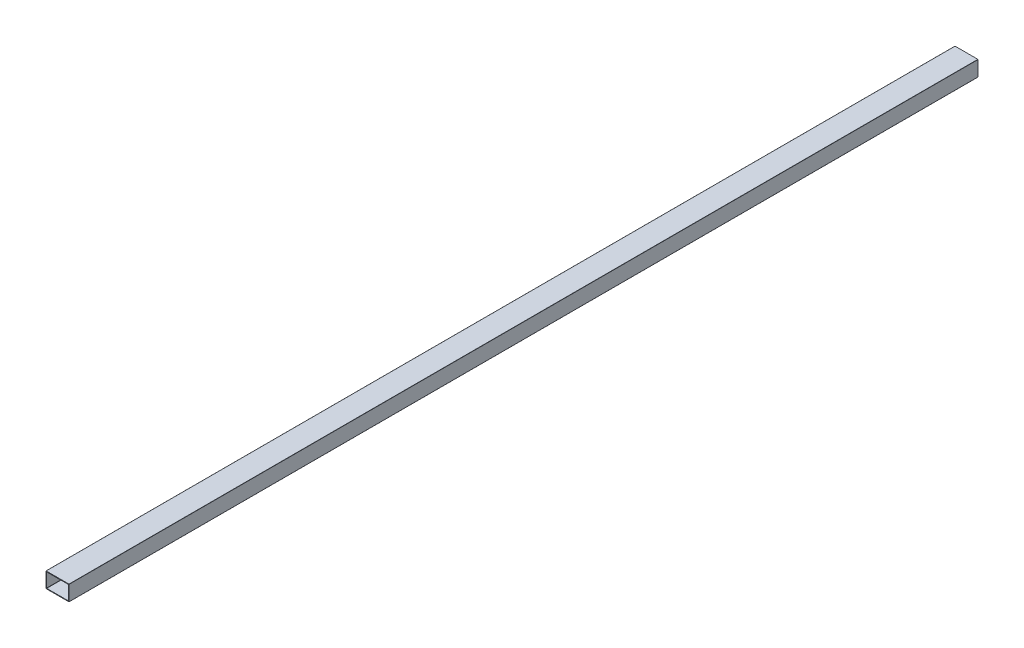
ISO-10303-21;
HEADER;
FILE_DESCRIPTION(('STEP AP214'),'2;1');
FILE_NAME('part.step','',(''),(''),'','','');
FILE_SCHEMA(('AUTOMOTIVE_DESIGN { 1 0 10303 214 1 1 1 1 }'));
ENDSEC;
DATA;
#1=APPLICATION_CONTEXT('core data for automotive mechanical design processes');
#2=APPLICATION_PROTOCOL_DEFINITION('international standard','automotive_design',2000,#1);
#3=PRODUCT_CONTEXT('',#1,'mechanical');
#4=PRODUCT('Part','Part','',(#3));
#5=PRODUCT_RELATED_PRODUCT_CATEGORY('part','',(#4));
#6=PRODUCT_DEFINITION_FORMATION('','',#4);
#7=PRODUCT_DEFINITION_CONTEXT('part definition',#1,'design');
#8=PRODUCT_DEFINITION('design','',#6,#7);
#9=PRODUCT_DEFINITION_SHAPE('','',#8);
#10=(LENGTH_UNIT() NAMED_UNIT(*) SI_UNIT(.MILLI.,.METRE.));
#11=(NAMED_UNIT(*) PLANE_ANGLE_UNIT() SI_UNIT($,.RADIAN.));
#12=(NAMED_UNIT(*) SI_UNIT($,.STERADIAN.) SOLID_ANGLE_UNIT());
#13=UNCERTAINTY_MEASURE_WITH_UNIT(LENGTH_MEASURE(1.E-05),#10,'distance_accuracy_value','');
#14=(GEOMETRIC_REPRESENTATION_CONTEXT(3) GLOBAL_UNCERTAINTY_ASSIGNED_CONTEXT((#13)) GLOBAL_UNIT_ASSIGNED_CONTEXT((#10,
#11,#12)) REPRESENTATION_CONTEXT('',''));
#15=CARTESIAN_POINT('',(0.,0.,0.));
#16=DIRECTION('',(0.,0.,1.));
#17=DIRECTION('',(1.,0.,0.));
#18=AXIS2_PLACEMENT_3D('',#15,#16,#17);
#19=CARTESIAN_POINT('',(76.2,-50.8,-6000.));
#20=DIRECTION('',(1.,0.,0.));
#21=DIRECTION('',(0.,0.,-1.));
#22=AXIS2_PLACEMENT_3D('',#19,#20,#21);
#23=PLANE('',#22);
#24=DIRECTION('',(0.,1.,0.));
#25=VECTOR('',#24,1.);
#26=CARTESIAN_POINT('',(76.2,-50.8,0.));
#27=LINE('',#26,#25);
#28=CARTESIAN_POINT('',(76.2,-49.8,0.));
#29=VERTEX_POINT('',#28);
#30=CARTESIAN_POINT('',(76.2,49.8,0.));
#31=VERTEX_POINT('',#30);
#32=EDGE_CURVE('E197',#29,#31,#27,.T.);
#33=ORIENTED_EDGE('',*,*,#32,.F.);
#34=DIRECTION('',(0.,0.,1.));
#35=VECTOR('',#34,1.);
#36=CARTESIAN_POINT('',(76.2,-49.8,-6000.));
#37=LINE('',#36,#35);
#38=CARTESIAN_POINT('',(76.2,-49.8,-6000.));
#39=VERTEX_POINT('',#38);
#40=EDGE_CURVE('E158',#29,#39,#37,.F.);
#41=ORIENTED_EDGE('',*,*,#40,.T.);
#42=DIRECTION('',(0.,1.,0.));
#43=VECTOR('',#42,1.);
#44=CARTESIAN_POINT('',(76.2,-50.8,-6000.));
#45=LINE('',#44,#43);
#46=CARTESIAN_POINT('',(76.2,49.8,-6000.));
#47=VERTEX_POINT('',#46);
#48=EDGE_CURVE('E185',#39,#47,#45,.T.);
#49=ORIENTED_EDGE('',*,*,#48,.T.);
#50=DIRECTION('',(0.,0.,1.));
#51=VECTOR('',#50,1.);
#52=CARTESIAN_POINT('',(76.2,49.8,-6000.));
#53=LINE('',#52,#51);
#54=EDGE_CURVE('E251',#47,#31,#53,.T.);
#55=ORIENTED_EDGE('',*,*,#54,.T.);
#56=EDGE_LOOP('',(#33,#41,#49,#55));
#57=FACE_BOUND('',#56,.T.);
#58=ADVANCED_FACE('F33',(#57),#23,.T.);
#59=CARTESIAN_POINT('',(-76.2,-50.8,-6000.));
#60=DIRECTION('',(0.,-1.,0.));
#61=DIRECTION('',(0.,0.,-1.));
#62=AXIS2_PLACEMENT_3D('',#59,#60,#61);
#63=PLANE('',#62);
#64=DIRECTION('',(1.,0.,0.));
#65=VECTOR('',#64,1.);
#66=CARTESIAN_POINT('',(-76.2,-50.8,0.));
#67=LINE('',#66,#65);
#68=CARTESIAN_POINT('',(-75.2,-50.8,0.));
#69=VERTEX_POINT('',#68);
#70=CARTESIAN_POINT('',(75.2,-50.8,0.));
#71=VERTEX_POINT('',#70);
#72=EDGE_CURVE('E189',#69,#71,#67,.T.);
#73=ORIENTED_EDGE('',*,*,#72,.F.);
#74=DIRECTION('',(0.,0.,1.));
#75=VECTOR('',#74,1.);
#76=CARTESIAN_POINT('',(-75.2,-50.8,-6000.));
#77=LINE('',#76,#75);
#78=CARTESIAN_POINT('',(-75.2,-50.8,-6000.));
#79=VERTEX_POINT('',#78);
#80=EDGE_CURVE('E238',#69,#79,#77,.F.);
#81=ORIENTED_EDGE('',*,*,#80,.T.);
#82=DIRECTION('',(1.,0.,0.));
#83=VECTOR('',#82,1.);
#84=CARTESIAN_POINT('',(-76.2,-50.8,-6000.));
#85=LINE('',#84,#83);
#86=CARTESIAN_POINT('',(75.2,-50.8,-6000.));
#87=VERTEX_POINT('',#86);
#88=EDGE_CURVE('E194',#79,#87,#85,.T.);
#89=ORIENTED_EDGE('',*,*,#88,.T.);
#90=DIRECTION('',(0.,0.,1.));
#91=VECTOR('',#90,1.);
#92=CARTESIAN_POINT('',(75.2,-50.8,-6000.));
#93=LINE('',#92,#91);
#94=EDGE_CURVE('E235',#87,#71,#93,.T.);
#95=ORIENTED_EDGE('',*,*,#94,.T.);
#96=EDGE_LOOP('',(#73,#81,#89,#95));
#97=FACE_BOUND('',#96,.T.);
#98=ADVANCED_FACE('F305',(#97),#63,.T.);
#99=CARTESIAN_POINT('',(-76.2,-50.8,-6000.));
#100=DIRECTION('',(-1.,0.,0.));
#101=DIRECTION('',(0.,0.,1.));
#102=AXIS2_PLACEMENT_3D('',#99,#100,#101);
#103=PLANE('',#102);
#104=DIRECTION('',(0.,-1.,0.));
#105=VECTOR('',#104,1.);
#106=CARTESIAN_POINT('',(-76.2,-50.8,-6000.));
#107=LINE('',#106,#105);
#108=CARTESIAN_POINT('',(-76.2,49.8,-6000.));
#109=VERTEX_POINT('',#108);
#110=CARTESIAN_POINT('',(-76.2,-49.8,-6000.));
#111=VERTEX_POINT('',#110);
#112=EDGE_CURVE('E191',#109,#111,#107,.T.);
#113=ORIENTED_EDGE('',*,*,#112,.T.);
#114=DIRECTION('',(0.,0.,1.));
#115=VECTOR('',#114,1.);
#116=CARTESIAN_POINT('',(-76.2,-49.8,-6000.));
#117=LINE('',#116,#115);
#118=CARTESIAN_POINT('',(-76.2,-49.8,0.));
#119=VERTEX_POINT('',#118);
#120=EDGE_CURVE('E224',#111,#119,#117,.T.);
#121=ORIENTED_EDGE('',*,*,#120,.T.);
#122=DIRECTION('',(0.,-1.,0.));
#123=VECTOR('',#122,1.);
#124=CARTESIAN_POINT('',(-76.2,-50.8,0.));
#125=LINE('',#124,#123);
#126=CARTESIAN_POINT('',(-76.2,49.8,0.));
#127=VERTEX_POINT('',#126);
#128=EDGE_CURVE('E203',#127,#119,#125,.T.);
#129=ORIENTED_EDGE('',*,*,#128,.F.);
#130=DIRECTION('',(0.,0.,1.));
#131=VECTOR('',#130,1.);
#132=CARTESIAN_POINT('',(-76.2,49.8,-6000.));
#133=LINE('',#132,#131);
#134=EDGE_CURVE('E222',#127,#109,#133,.F.);
#135=ORIENTED_EDGE('',*,*,#134,.T.);
#136=EDGE_LOOP('',(#113,#121,#129,#135));
#137=FACE_BOUND('',#136,.T.);
#138=ADVANCED_FACE('F311',(#137),#103,.T.);
#139=CARTESIAN_POINT('',(-76.2,50.8,-6000.));
#140=DIRECTION('',(0.,1.,0.));
#141=DIRECTION('',(0.,0.,1.));
#142=AXIS2_PLACEMENT_3D('',#139,#140,#141);
#143=PLANE('',#142);
#144=DIRECTION('',(-1.,0.,0.));
#145=VECTOR('',#144,1.);
#146=CARTESIAN_POINT('',(-76.2,50.8,-6000.));
#147=LINE('',#146,#145);
#148=CARTESIAN_POINT('',(75.2,50.8,-6000.));
#149=VERTEX_POINT('',#148);
#150=CARTESIAN_POINT('',(-75.2,50.8,-6000.));
#151=VERTEX_POINT('',#150);
#152=EDGE_CURVE('E188',#149,#151,#147,.T.);
#153=ORIENTED_EDGE('',*,*,#152,.T.);
#154=DIRECTION('',(0.,0.,1.));
#155=VECTOR('',#154,1.);
#156=CARTESIAN_POINT('',(-75.2,50.8,-6000.));
#157=LINE('',#156,#155);
#158=CARTESIAN_POINT('',(-75.2,50.8,0.));
#159=VERTEX_POINT('',#158);
#160=EDGE_CURVE('E248',#151,#159,#157,.T.);
#161=ORIENTED_EDGE('',*,*,#160,.T.);
#162=DIRECTION('',(-1.,0.,0.));
#163=VECTOR('',#162,1.);
#164=CARTESIAN_POINT('',(-76.2,50.8,0.));
#165=LINE('',#164,#163);
#166=CARTESIAN_POINT('',(75.2,50.8,0.));
#167=VERTEX_POINT('',#166);
#168=EDGE_CURVE('E200',#167,#159,#165,.T.);
#169=ORIENTED_EDGE('',*,*,#168,.F.);
#170=DIRECTION('',(0.,0.,1.));
#171=VECTOR('',#170,1.);
#172=CARTESIAN_POINT('',(75.2,50.8,-6000.));
#173=LINE('',#172,#171);
#174=EDGE_CURVE('E55',#167,#149,#173,.F.);
#175=ORIENTED_EDGE('',*,*,#174,.T.);
#176=EDGE_LOOP('',(#153,#161,#169,#175));
#177=FACE_BOUND('',#176,.T.);
#178=ADVANCED_FACE('F316',(#177),#143,.T.);
#179=CARTESIAN_POINT('',(0.,0.,-6000.));
#180=DIRECTION('',(0.,0.,-1.));
#181=DIRECTION('',(-1.,0.,0.));
#182=AXIS2_PLACEMENT_3D('',#179,#180,#181);
#183=PLANE('',#182);
#184=DIRECTION('',(0.,-1.,0.));
#185=VECTOR('',#184,1.);
#186=CARTESIAN_POINT('',(-72.4,-47.,-6000.));
#187=LINE('',#186,#185);
#188=CARTESIAN_POINT('',(-72.4,46.,-6000.));
#189=VERTEX_POINT('',#188);
#190=CARTESIAN_POINT('',(-72.4,-46.,-6000.));
#191=VERTEX_POINT('',#190);
#192=EDGE_CURVE('E167',#189,#191,#187,.T.);
#193=ORIENTED_EDGE('',*,*,#192,.T.);
#194=CARTESIAN_POINT('',(-71.4,-46.,-6000.));
#195=DIRECTION('',(0.,0.,-1.));
#196=DIRECTION('',(-1.,0.,0.));
#197=AXIS2_PLACEMENT_3D('',#194,#195,#196);
#198=CIRCLE('',#197,1.);
#199=CARTESIAN_POINT('',(-71.4,-47.,-6000.));
#200=VERTEX_POINT('',#199);
#201=EDGE_CURVE('E11',#191,#200,#198,.F.);
#202=ORIENTED_EDGE('',*,*,#201,.T.);
#203=DIRECTION('',(1.,0.,0.));
#204=VECTOR('',#203,1.);
#205=CARTESIAN_POINT('',(-72.4,-47.,-6000.));
#206=LINE('',#205,#204);
#207=CARTESIAN_POINT('',(71.4,-47.,-6000.));
#208=VERTEX_POINT('',#207);
#209=EDGE_CURVE('E175',#200,#208,#206,.T.);
#210=ORIENTED_EDGE('',*,*,#209,.T.);
#211=CARTESIAN_POINT('',(71.4,-46.,-6000.));
#212=DIRECTION('',(0.,0.,-1.));
#213=DIRECTION('',(-1.,0.,0.));
#214=AXIS2_PLACEMENT_3D('',#211,#212,#213);
#215=CIRCLE('',#214,1.);
#216=CARTESIAN_POINT('',(72.4,-46.,-6000.));
#217=VERTEX_POINT('',#216);
#218=EDGE_CURVE('E262',#208,#217,#215,.F.);
#219=ORIENTED_EDGE('',*,*,#218,.T.);
#220=DIRECTION('',(0.,1.,0.));
#221=VECTOR('',#220,1.);
#222=CARTESIAN_POINT('',(72.4,-47.,-6000.));
#223=LINE('',#222,#221);
#224=CARTESIAN_POINT('',(72.4,46.,-6000.));
#225=VERTEX_POINT('',#224);
#226=EDGE_CURVE('E179',#217,#225,#223,.T.);
#227=ORIENTED_EDGE('',*,*,#226,.T.);
#228=CARTESIAN_POINT('',(71.4,46.,-6000.));
#229=DIRECTION('',(0.,0.,-1.));
#230=DIRECTION('',(-1.,0.,0.));
#231=AXIS2_PLACEMENT_3D('',#228,#229,#230);
#232=CIRCLE('',#231,1.);
#233=CARTESIAN_POINT('',(71.4,47.,-6000.));
#234=VERTEX_POINT('',#233);
#235=EDGE_CURVE('E258',#225,#234,#232,.F.);
#236=ORIENTED_EDGE('',*,*,#235,.T.);
#237=DIRECTION('',(-1.,0.,0.));
#238=VECTOR('',#237,1.);
#239=CARTESIAN_POINT('',(-72.4,47.,-6000.));
#240=LINE('',#239,#238);
#241=CARTESIAN_POINT('',(-71.4,47.,-6000.));
#242=VERTEX_POINT('',#241);
#243=EDGE_CURVE('E277',#234,#242,#240,.T.);
#244=ORIENTED_EDGE('',*,*,#243,.T.);
#245=CARTESIAN_POINT('',(-71.4,46.,-6000.));
#246=DIRECTION('',(0.,0.,-1.));
#247=DIRECTION('',(-1.,0.,0.));
#248=AXIS2_PLACEMENT_3D('',#245,#246,#247);
#249=CIRCLE('',#248,1.);
#250=EDGE_CURVE('E157',#242,#189,#249,.F.);
#251=ORIENTED_EDGE('',*,*,#250,.T.);
#252=EDGE_LOOP('',(#193,#202,#210,#219,#227,#236,#244,#251));
#253=FACE_BOUND('',#252,.T.);
#254=ORIENTED_EDGE('',*,*,#88,.F.);
#255=CARTESIAN_POINT('',(-75.2,-49.8,-6000.));
#256=DIRECTION('',(0.,0.,-1.));
#257=DIRECTION('',(-1.,0.,0.));
#258=AXIS2_PLACEMENT_3D('',#255,#256,#257);
#259=CIRCLE('',#258,1.);
#260=EDGE_CURVE('E245',#79,#111,#259,.T.);
#261=ORIENTED_EDGE('',*,*,#260,.T.);
#262=ORIENTED_EDGE('',*,*,#112,.F.);
#263=CARTESIAN_POINT('',(-75.2,49.8,-6000.));
#264=DIRECTION('',(0.,0.,-1.));
#265=DIRECTION('',(-1.,0.,0.));
#266=AXIS2_PLACEMENT_3D('',#263,#264,#265);
#267=CIRCLE('',#266,1.);
#268=EDGE_CURVE('E48',#109,#151,#267,.T.);
#269=ORIENTED_EDGE('',*,*,#268,.T.);
#270=ORIENTED_EDGE('',*,*,#152,.F.);
#271=CARTESIAN_POINT('',(75.2,49.8,-6000.));
#272=DIRECTION('',(0.,0.,-1.));
#273=DIRECTION('',(-1.,0.,0.));
#274=AXIS2_PLACEMENT_3D('',#271,#272,#273);
#275=CIRCLE('',#274,1.);
#276=EDGE_CURVE('E240',#149,#47,#275,.T.);
#277=ORIENTED_EDGE('',*,*,#276,.T.);
#278=ORIENTED_EDGE('',*,*,#48,.F.);
#279=CARTESIAN_POINT('',(75.2,-49.8,-6000.));
#280=DIRECTION('',(0.,0.,-1.));
#281=DIRECTION('',(-1.,0.,0.));
#282=AXIS2_PLACEMENT_3D('',#279,#280,#281);
#283=CIRCLE('',#282,1.);
#284=EDGE_CURVE('E242',#39,#87,#283,.T.);
#285=ORIENTED_EDGE('',*,*,#284,.T.);
#286=EDGE_LOOP('',(#254,#261,#262,#269,#270,#277,#278,#285));
#287=FACE_BOUND('',#286,.T.);
#288=ADVANCED_FACE('F267',(#253,#287),#183,.T.);
#289=CARTESIAN_POINT('',(0.,0.,0.));
#290=DIRECTION('',(0.,0.,-1.));
#291=DIRECTION('',(-1.,0.,0.));
#292=AXIS2_PLACEMENT_3D('',#289,#290,#291);
#293=PLANE('',#292);
#294=DIRECTION('',(0.,1.,0.));
#295=VECTOR('',#294,1.);
#296=CARTESIAN_POINT('',(72.4,-47.,0.));
#297=LINE('',#296,#295);
#298=CARTESIAN_POINT('',(72.4,-46.,0.));
#299=VERTEX_POINT('',#298);
#300=CARTESIAN_POINT('',(72.4,46.,0.));
#301=VERTEX_POINT('',#300);
#302=EDGE_CURVE('E181',#299,#301,#297,.T.);
#303=ORIENTED_EDGE('',*,*,#302,.F.);
#304=CARTESIAN_POINT('',(71.4,-46.,0.));
#305=DIRECTION('',(0.,0.,-1.));
#306=DIRECTION('',(-1.,0.,0.));
#307=AXIS2_PLACEMENT_3D('',#304,#305,#306);
#308=CIRCLE('',#307,1.);
#309=CARTESIAN_POINT('',(71.4,-47.,0.));
#310=VERTEX_POINT('',#309);
#311=EDGE_CURVE('E260',#299,#310,#308,.T.);
#312=ORIENTED_EDGE('',*,*,#311,.T.);
#313=DIRECTION('',(1.,0.,0.));
#314=VECTOR('',#313,1.);
#315=CARTESIAN_POINT('',(-72.4,-47.,0.));
#316=LINE('',#315,#314);
#317=CARTESIAN_POINT('',(-71.4,-47.,0.));
#318=VERTEX_POINT('',#317);
#319=EDGE_CURVE('E281',#318,#310,#316,.T.);
#320=ORIENTED_EDGE('',*,*,#319,.F.);
#321=CARTESIAN_POINT('',(-71.4,-46.,0.));
#322=DIRECTION('',(0.,0.,-1.));
#323=DIRECTION('',(-1.,0.,0.));
#324=AXIS2_PLACEMENT_3D('',#321,#322,#323);
#325=CIRCLE('',#324,1.);
#326=CARTESIAN_POINT('',(-72.4,-46.,0.));
#327=VERTEX_POINT('',#326);
#328=EDGE_CURVE('E41',#318,#327,#325,.T.);
#329=ORIENTED_EDGE('',*,*,#328,.T.);
#330=DIRECTION('',(0.,-1.,0.));
#331=VECTOR('',#330,1.);
#332=CARTESIAN_POINT('',(-72.4,-47.,0.));
#333=LINE('',#332,#331);
#334=CARTESIAN_POINT('',(-72.4,46.,0.));
#335=VERTEX_POINT('',#334);
#336=EDGE_CURVE('E164',#335,#327,#333,.T.);
#337=ORIENTED_EDGE('',*,*,#336,.F.);
#338=CARTESIAN_POINT('',(-71.4,46.,0.));
#339=DIRECTION('',(0.,0.,-1.));
#340=DIRECTION('',(-1.,0.,0.));
#341=AXIS2_PLACEMENT_3D('',#338,#339,#340);
#342=CIRCLE('',#341,1.);
#343=CARTESIAN_POINT('',(-71.4,47.,0.));
#344=VERTEX_POINT('',#343);
#345=EDGE_CURVE('E147',#335,#344,#342,.T.);
#346=ORIENTED_EDGE('',*,*,#345,.T.);
#347=DIRECTION('',(-1.,0.,0.));
#348=VECTOR('',#347,1.);
#349=CARTESIAN_POINT('',(-72.4,47.,0.));
#350=LINE('',#349,#348);
#351=CARTESIAN_POINT('',(71.4,47.,0.));
#352=VERTEX_POINT('',#351);
#353=EDGE_CURVE('E176',#352,#344,#350,.T.);
#354=ORIENTED_EDGE('',*,*,#353,.F.);
#355=CARTESIAN_POINT('',(71.4,46.,0.));
#356=DIRECTION('',(0.,0.,-1.));
#357=DIRECTION('',(-1.,0.,0.));
#358=AXIS2_PLACEMENT_3D('',#355,#356,#357);
#359=CIRCLE('',#358,1.);
#360=EDGE_CURVE('E256',#352,#301,#359,.T.);
#361=ORIENTED_EDGE('',*,*,#360,.T.);
#362=EDGE_LOOP('',(#303,#312,#320,#329,#337,#346,#354,#361));
#363=FACE_BOUND('',#362,.T.);
#364=ORIENTED_EDGE('',*,*,#128,.T.);
#365=CARTESIAN_POINT('',(-75.2,-49.8,0.));
#366=DIRECTION('',(0.,0.,-1.));
#367=DIRECTION('',(-1.,0.,0.));
#368=AXIS2_PLACEMENT_3D('',#365,#366,#367);
#369=CIRCLE('',#368,1.);
#370=EDGE_CURVE('E233',#119,#69,#369,.F.);
#371=ORIENTED_EDGE('',*,*,#370,.T.);
#372=ORIENTED_EDGE('',*,*,#72,.T.);
#373=CARTESIAN_POINT('',(75.2,-49.8,0.));
#374=DIRECTION('',(0.,0.,-1.));
#375=DIRECTION('',(-1.,0.,0.));
#376=AXIS2_PLACEMENT_3D('',#373,#374,#375);
#377=CIRCLE('',#376,1.);
#378=EDGE_CURVE('E229',#71,#29,#377,.F.);
#379=ORIENTED_EDGE('',*,*,#378,.T.);
#380=ORIENTED_EDGE('',*,*,#32,.T.);
#381=CARTESIAN_POINT('',(75.2,49.8,0.));
#382=DIRECTION('',(0.,0.,-1.));
#383=DIRECTION('',(-1.,0.,0.));
#384=AXIS2_PLACEMENT_3D('',#381,#382,#383);
#385=CIRCLE('',#384,1.);
#386=EDGE_CURVE('E227',#31,#167,#385,.F.);
#387=ORIENTED_EDGE('',*,*,#386,.T.);
#388=ORIENTED_EDGE('',*,*,#168,.T.);
#389=CARTESIAN_POINT('',(-75.2,49.8,0.));
#390=DIRECTION('',(0.,0.,-1.));
#391=DIRECTION('',(-1.,0.,0.));
#392=AXIS2_PLACEMENT_3D('',#389,#390,#391);
#393=CIRCLE('',#392,1.);
#394=EDGE_CURVE('E231',#159,#127,#393,.F.);
#395=ORIENTED_EDGE('',*,*,#394,.T.);
#396=EDGE_LOOP('',(#364,#371,#372,#379,#380,#387,#388,#395));
#397=FACE_BOUND('',#396,.T.);
#398=ADVANCED_FACE('F172',(#363,#397),#293,.F.);
#399=CARTESIAN_POINT('',(-72.4,-47.,-6000.));
#400=DIRECTION('',(0.,-1.,0.));
#401=DIRECTION('',(0.,0.,-1.));
#402=AXIS2_PLACEMENT_3D('',#399,#400,#401);
#403=PLANE('',#402);
#404=ORIENTED_EDGE('',*,*,#319,.T.);
#405=DIRECTION('',(0.,0.,1.));
#406=VECTOR('',#405,1.);
#407=CARTESIAN_POINT('',(71.4,-47.,-6000.));
#408=LINE('',#407,#406);
#409=EDGE_CURVE('E220',#310,#208,#408,.F.);
#410=ORIENTED_EDGE('',*,*,#409,.T.);
#411=ORIENTED_EDGE('',*,*,#209,.F.);
#412=DIRECTION('',(0.,0.,1.));
#413=VECTOR('',#412,1.);
#414=CARTESIAN_POINT('',(-71.4,-47.,0.));
#415=LINE('',#414,#413);
#416=EDGE_CURVE('E217',#200,#318,#415,.T.);
#417=ORIENTED_EDGE('',*,*,#416,.T.);
#418=EDGE_LOOP('',(#404,#410,#411,#417));
#419=FACE_BOUND('',#418,.T.);
#420=ADVANCED_FACE('F283',(#419),#403,.F.);
#421=CARTESIAN_POINT('',(-72.4,-47.,-6000.));
#422=DIRECTION('',(-1.,0.,0.));
#423=DIRECTION('',(0.,0.,1.));
#424=AXIS2_PLACEMENT_3D('',#421,#422,#423);
#425=PLANE('',#424);
#426=ORIENTED_EDGE('',*,*,#192,.F.);
#427=DIRECTION('',(0.,0.,1.));
#428=VECTOR('',#427,1.);
#429=CARTESIAN_POINT('',(-72.4,46.,0.));
#430=LINE('',#429,#428);
#431=EDGE_CURVE('E151',#189,#335,#430,.T.);
#432=ORIENTED_EDGE('',*,*,#431,.T.);
#433=ORIENTED_EDGE('',*,*,#336,.T.);
#434=DIRECTION('',(0.,0.,1.));
#435=VECTOR('',#434,1.);
#436=CARTESIAN_POINT('',(-72.4,-46.,-6000.));
#437=LINE('',#436,#435);
#438=EDGE_CURVE('E169',#327,#191,#437,.F.);
#439=ORIENTED_EDGE('',*,*,#438,.T.);
#440=EDGE_LOOP('',(#426,#432,#433,#439));
#441=FACE_BOUND('',#440,.T.);
#442=ADVANCED_FACE('F163',(#441),#425,.F.);
#443=CARTESIAN_POINT('',(-72.4,47.,-6000.));
#444=DIRECTION('',(0.,1.,0.));
#445=DIRECTION('',(0.,0.,1.));
#446=AXIS2_PLACEMENT_3D('',#443,#444,#445);
#447=PLANE('',#446);
#448=ORIENTED_EDGE('',*,*,#353,.T.);
#449=DIRECTION('',(0.,0.,1.));
#450=VECTOR('',#449,1.);
#451=CARTESIAN_POINT('',(-71.4,47.,-6000.));
#452=LINE('',#451,#450);
#453=EDGE_CURVE('E152',#344,#242,#452,.F.);
#454=ORIENTED_EDGE('',*,*,#453,.T.);
#455=ORIENTED_EDGE('',*,*,#243,.F.);
#456=DIRECTION('',(0.,0.,1.));
#457=VECTOR('',#456,1.);
#458=CARTESIAN_POINT('',(71.4,47.,0.));
#459=LINE('',#458,#457);
#460=EDGE_CURVE('E168',#234,#352,#459,.T.);
#461=ORIENTED_EDGE('',*,*,#460,.T.);
#462=EDGE_LOOP('',(#448,#454,#455,#461));
#463=FACE_BOUND('',#462,.T.);
#464=ADVANCED_FACE('F292',(#463),#447,.F.);
#465=CARTESIAN_POINT('',(72.4,-47.,-6000.));
#466=DIRECTION('',(1.,0.,0.));
#467=DIRECTION('',(0.,0.,-1.));
#468=AXIS2_PLACEMENT_3D('',#465,#466,#467);
#469=PLANE('',#468);
#470=ORIENTED_EDGE('',*,*,#302,.T.);
#471=DIRECTION('',(0.,0.,1.));
#472=VECTOR('',#471,1.);
#473=CARTESIAN_POINT('',(72.4,46.,-6000.));
#474=LINE('',#473,#472);
#475=EDGE_CURVE('E215',#301,#225,#474,.F.);
#476=ORIENTED_EDGE('',*,*,#475,.T.);
#477=ORIENTED_EDGE('',*,*,#226,.F.);
#478=DIRECTION('',(0.,0.,1.));
#479=VECTOR('',#478,1.);
#480=CARTESIAN_POINT('',(72.4,-46.,0.));
#481=LINE('',#480,#479);
#482=EDGE_CURVE('E212',#217,#299,#481,.T.);
#483=ORIENTED_EDGE('',*,*,#482,.T.);
#484=EDGE_LOOP('',(#470,#476,#477,#483));
#485=FACE_BOUND('',#484,.T.);
#486=ADVANCED_FACE('F275',(#485),#469,.F.);
#487=CARTESIAN_POINT('',(-71.4,46.,-6000.));
#488=DIRECTION('',(0.,0.,-1.));
#489=DIRECTION('',(-1.,0.,0.));
#490=AXIS2_PLACEMENT_3D('',#487,#488,#489);
#491=CYLINDRICAL_SURFACE('',#490,1.);
#492=ORIENTED_EDGE('',*,*,#250,.F.);
#493=ORIENTED_EDGE('',*,*,#453,.F.);
#494=ORIENTED_EDGE('',*,*,#345,.F.);
#495=ORIENTED_EDGE('',*,*,#431,.F.);
#496=EDGE_LOOP('',(#492,#493,#494,#495));
#497=FACE_BOUND('',#496,.T.);
#498=ADVANCED_FACE('F150',(#497),#491,.F.);
#499=CARTESIAN_POINT('',(71.4,46.,-6000.));
#500=DIRECTION('',(0.,0.,-1.));
#501=DIRECTION('',(-1.,0.,0.));
#502=AXIS2_PLACEMENT_3D('',#499,#500,#501);
#503=CYLINDRICAL_SURFACE('',#502,1.);
#504=ORIENTED_EDGE('',*,*,#235,.F.);
#505=ORIENTED_EDGE('',*,*,#475,.F.);
#506=ORIENTED_EDGE('',*,*,#360,.F.);
#507=ORIENTED_EDGE('',*,*,#460,.F.);
#508=EDGE_LOOP('',(#504,#505,#506,#507));
#509=FACE_BOUND('',#508,.T.);
#510=ADVANCED_FACE('F294',(#509),#503,.F.);
#511=CARTESIAN_POINT('',(71.4,-46.,-6000.));
#512=DIRECTION('',(0.,0.,-1.));
#513=DIRECTION('',(-1.,0.,0.));
#514=AXIS2_PLACEMENT_3D('',#511,#512,#513);
#515=CYLINDRICAL_SURFACE('',#514,1.);
#516=ORIENTED_EDGE('',*,*,#218,.F.);
#517=ORIENTED_EDGE('',*,*,#409,.F.);
#518=ORIENTED_EDGE('',*,*,#311,.F.);
#519=ORIENTED_EDGE('',*,*,#482,.F.);
#520=EDGE_LOOP('',(#516,#517,#518,#519));
#521=FACE_BOUND('',#520,.T.);
#522=ADVANCED_FACE('F279',(#521),#515,.F.);
#523=CARTESIAN_POINT('',(-75.2,-49.8,-6000.));
#524=DIRECTION('',(0.,0.,1.));
#525=DIRECTION('',(1.,0.,0.));
#526=AXIS2_PLACEMENT_3D('',#523,#524,#525);
#527=CYLINDRICAL_SURFACE('',#526,1.);
#528=ORIENTED_EDGE('',*,*,#260,.F.);
#529=ORIENTED_EDGE('',*,*,#80,.F.);
#530=ORIENTED_EDGE('',*,*,#370,.F.);
#531=ORIENTED_EDGE('',*,*,#120,.F.);
#532=EDGE_LOOP('',(#528,#529,#530,#531));
#533=FACE_BOUND('',#532,.T.);
#534=ADVANCED_FACE('F301',(#533),#527,.T.);
#535=CARTESIAN_POINT('',(-75.2,49.8,-6000.));
#536=DIRECTION('',(0.,0.,1.));
#537=DIRECTION('',(1.,0.,0.));
#538=AXIS2_PLACEMENT_3D('',#535,#536,#537);
#539=CYLINDRICAL_SURFACE('',#538,1.);
#540=ORIENTED_EDGE('',*,*,#268,.F.);
#541=ORIENTED_EDGE('',*,*,#134,.F.);
#542=ORIENTED_EDGE('',*,*,#394,.F.);
#543=ORIENTED_EDGE('',*,*,#160,.F.);
#544=EDGE_LOOP('',(#540,#541,#542,#543));
#545=FACE_BOUND('',#544,.T.);
#546=ADVANCED_FACE('F368',(#545),#539,.T.);
#547=CARTESIAN_POINT('',(-71.4,-46.,-6000.));
#548=DIRECTION('',(0.,0.,-1.));
#549=DIRECTION('',(-1.,0.,0.));
#550=AXIS2_PLACEMENT_3D('',#547,#548,#549);
#551=CYLINDRICAL_SURFACE('',#550,1.);
#552=ORIENTED_EDGE('',*,*,#201,.F.);
#553=ORIENTED_EDGE('',*,*,#438,.F.);
#554=ORIENTED_EDGE('',*,*,#328,.F.);
#555=ORIENTED_EDGE('',*,*,#416,.F.);
#556=EDGE_LOOP('',(#552,#553,#554,#555));
#557=FACE_BOUND('',#556,.T.);
#558=ADVANCED_FACE('F378',(#557),#551,.F.);
#559=CARTESIAN_POINT('',(75.2,-49.8,-6000.));
#560=DIRECTION('',(0.,0.,1.));
#561=DIRECTION('',(1.,0.,0.));
#562=AXIS2_PLACEMENT_3D('',#559,#560,#561);
#563=CYLINDRICAL_SURFACE('',#562,1.);
#564=ORIENTED_EDGE('',*,*,#284,.F.);
#565=ORIENTED_EDGE('',*,*,#40,.F.);
#566=ORIENTED_EDGE('',*,*,#378,.F.);
#567=ORIENTED_EDGE('',*,*,#94,.F.);
#568=EDGE_LOOP('',(#564,#565,#566,#567));
#569=FACE_BOUND('',#568,.T.);
#570=ADVANCED_FACE('F388',(#569),#563,.T.);
#571=CARTESIAN_POINT('',(75.2,49.8,-6000.));
#572=DIRECTION('',(0.,0.,1.));
#573=DIRECTION('',(1.,0.,0.));
#574=AXIS2_PLACEMENT_3D('',#571,#572,#573);
#575=CYLINDRICAL_SURFACE('',#574,1.);
#576=ORIENTED_EDGE('',*,*,#276,.F.);
#577=ORIENTED_EDGE('',*,*,#174,.F.);
#578=ORIENTED_EDGE('',*,*,#386,.F.);
#579=ORIENTED_EDGE('',*,*,#54,.F.);
#580=EDGE_LOOP('',(#576,#577,#578,#579));
#581=FACE_BOUND('',#580,.T.);
#582=ADVANCED_FACE('F35',(#581),#575,.T.);
#583=CLOSED_SHELL('',(#58,#98,#138,#178,#288,#398,#420,#442,#464,#486,#498,#510,#522,#534,#546,
#558,#570,#582));
#584=MANIFOLD_SOLID_BREP('B2',#583);
#585=ADVANCED_BREP_SHAPE_REPRESENTATION('',(#18,#584),#14);
#586=SHAPE_DEFINITION_REPRESENTATION(#9,#585);
ENDSEC;
END-ISO-10303-21;
